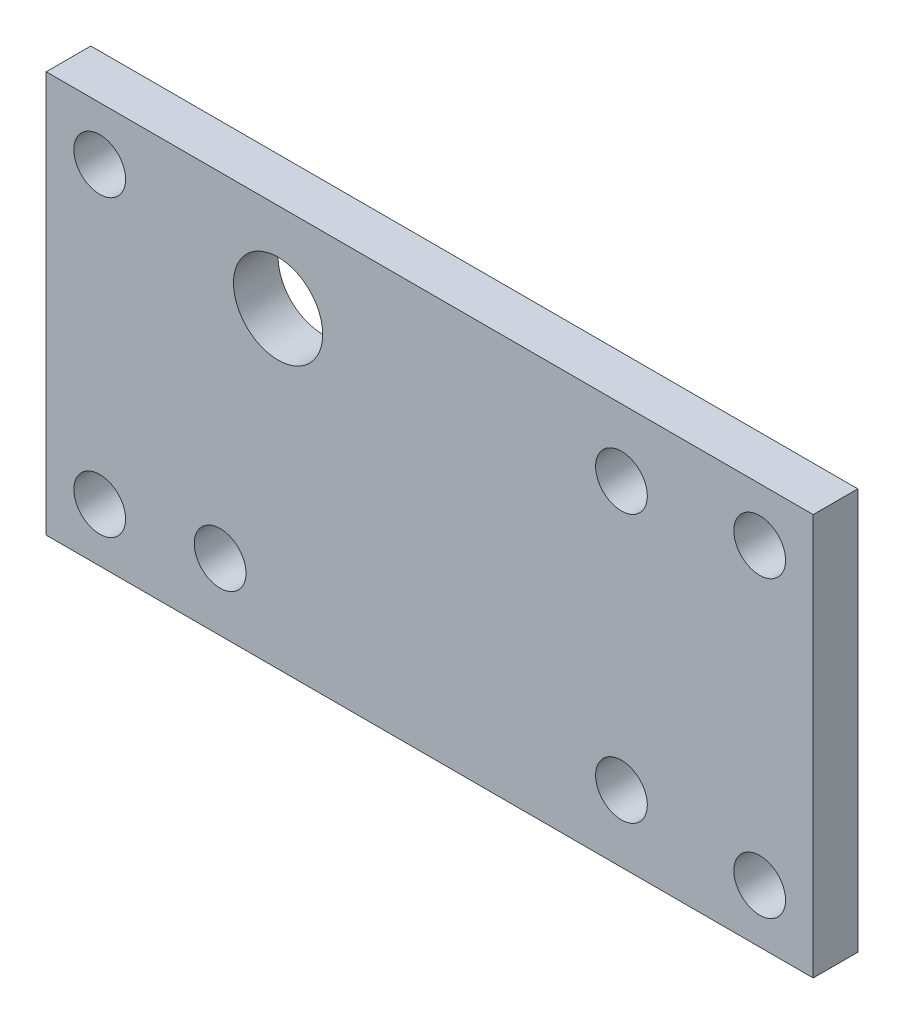
ISO-10303-21;
HEADER;
FILE_DESCRIPTION(('STEP AP214'),'2;1');
FILE_NAME('part.step','',(''),(''),'','','');
FILE_SCHEMA(('AUTOMOTIVE_DESIGN { 1 0 10303 214 1 1 1 1 }'));
ENDSEC;
DATA;
#1=APPLICATION_CONTEXT('core data for automotive mechanical design processes');
#2=APPLICATION_PROTOCOL_DEFINITION('international standard','automotive_design',2000,#1);
#3=PRODUCT_CONTEXT('',#1,'mechanical');
#4=PRODUCT('Part','Part','',(#3));
#5=PRODUCT_RELATED_PRODUCT_CATEGORY('part','',(#4));
#6=PRODUCT_DEFINITION_FORMATION('','',#4);
#7=PRODUCT_DEFINITION_CONTEXT('part definition',#1,'design');
#8=PRODUCT_DEFINITION('design','',#6,#7);
#9=PRODUCT_DEFINITION_SHAPE('','',#8);
#10=(LENGTH_UNIT() NAMED_UNIT(*) SI_UNIT(.MILLI.,.METRE.));
#11=(NAMED_UNIT(*) PLANE_ANGLE_UNIT() SI_UNIT($,.RADIAN.));
#12=(NAMED_UNIT(*) SI_UNIT($,.STERADIAN.) SOLID_ANGLE_UNIT());
#13=UNCERTAINTY_MEASURE_WITH_UNIT(LENGTH_MEASURE(1.E-05),#10,'distance_accuracy_value','');
#14=(GEOMETRIC_REPRESENTATION_CONTEXT(3) GLOBAL_UNCERTAINTY_ASSIGNED_CONTEXT((#13)) GLOBAL_UNIT_ASSIGNED_CONTEXT((#10,
#11,#12)) REPRESENTATION_CONTEXT('',''));
#15=CARTESIAN_POINT('',(0.,0.,0.));
#16=DIRECTION('',(0.,0.,1.));
#17=DIRECTION('',(1.,0.,0.));
#18=AXIS2_PLACEMENT_3D('',#15,#16,#17);
#19=CARTESIAN_POINT('',(0.,0.,3.175));
#20=DIRECTION('',(0.,0.,1.));
#21=DIRECTION('',(1.,0.,0.));
#22=AXIS2_PLACEMENT_3D('',#19,#20,#21);
#23=PLANE('',#22);
#24=CARTESIAN_POINT('',(-14.9225,-9.52500000000952,3.175));
#25=DIRECTION('',(0.,0.,1.));
#26=DIRECTION('',(1.,0.,0.));
#27=AXIS2_PLACEMENT_3D('',#24,#25,#26);
#28=CIRCLE('',#27,1.84149999999178);
#29=CARTESIAN_POINT('',(-13.0810000000082,-9.52500000000952,3.175));
#30=VERTEX_POINT('',#29);
#31=EDGE_CURVE('E189',#30,#30,#28,.T.);
#32=ORIENTED_EDGE('',*,*,#31,.F.);
#33=EDGE_LOOP('',(#32));
#34=FACE_BOUND('',#33,.T.);
#35=CARTESIAN_POINT('',(13.6525,-9.52500000000954,3.175));
#36=DIRECTION('',(0.,0.,1.));
#37=DIRECTION('',(1.,0.,0.));
#38=AXIS2_PLACEMENT_3D('',#35,#36,#37);
#39=CIRCLE('',#38,1.84149999999759);
#40=CARTESIAN_POINT('',(15.4939999999976,-9.52500000000954,3.175));
#41=VERTEX_POINT('',#40);
#42=EDGE_CURVE('E185',#41,#41,#39,.T.);
#43=ORIENTED_EDGE('',*,*,#42,.F.);
#44=EDGE_LOOP('',(#43));
#45=FACE_BOUND('',#44,.T.);
#46=CARTESIAN_POINT('',(13.6525,9.52499999999986,3.175));
#47=DIRECTION('',(0.,0.,1.));
#48=DIRECTION('',(1.,0.,0.));
#49=AXIS2_PLACEMENT_3D('',#46,#47,#48);
#50=CIRCLE('',#49,1.8415);
#51=CARTESIAN_POINT('',(15.494,9.52499999999986,3.175));
#52=VERTEX_POINT('',#51);
#53=EDGE_CURVE('E173',#52,#52,#50,.T.);
#54=ORIENTED_EDGE('',*,*,#53,.F.);
#55=EDGE_LOOP('',(#54));
#56=FACE_BOUND('',#55,.T.);
#57=CARTESIAN_POINT('',(23.495,10.4775,3.175));
#58=DIRECTION('',(0.,0.,1.));
#59=DIRECTION('',(1.,0.,0.));
#60=AXIS2_PLACEMENT_3D('',#57,#58,#59);
#61=CIRCLE('',#60,1.8415);
#62=CARTESIAN_POINT('',(25.3365,10.4775,3.175));
#63=VERTEX_POINT('',#62);
#64=EDGE_CURVE('E153',#63,#63,#61,.T.);
#65=ORIENTED_EDGE('',*,*,#64,.F.);
#66=EDGE_LOOP('',(#65));
#67=FACE_BOUND('',#66,.T.);
#68=CARTESIAN_POINT('',(23.495,-10.4775,3.175));
#69=DIRECTION('',(0.,0.,1.));
#70=DIRECTION('',(1.,0.,0.));
#71=AXIS2_PLACEMENT_3D('',#68,#69,#70);
#72=CIRCLE('',#71,1.8415);
#73=CARTESIAN_POINT('',(25.3365,-10.4775,3.175));
#74=VERTEX_POINT('',#73);
#75=EDGE_CURVE('E162',#74,#74,#72,.T.);
#76=ORIENTED_EDGE('',*,*,#75,.F.);
#77=EDGE_LOOP('',(#76));
#78=FACE_BOUND('',#77,.T.);
#79=CARTESIAN_POINT('',(-23.495,-10.4775,3.175));
#80=DIRECTION('',(0.,0.,1.));
#81=DIRECTION('',(1.,0.,0.));
#82=AXIS2_PLACEMENT_3D('',#79,#80,#81);
#83=CIRCLE('',#82,1.8415);
#84=CARTESIAN_POINT('',(-21.6535,-10.4775,3.175));
#85=VERTEX_POINT('',#84);
#86=EDGE_CURVE('E145',#85,#85,#83,.T.);
#87=ORIENTED_EDGE('',*,*,#86,.F.);
#88=EDGE_LOOP('',(#87));
#89=FACE_BOUND('',#88,.T.);
#90=CARTESIAN_POINT('',(-23.495,10.4775,3.175));
#91=DIRECTION('',(0.,0.,1.));
#92=DIRECTION('',(1.,0.,0.));
#93=AXIS2_PLACEMENT_3D('',#90,#91,#92);
#94=CIRCLE('',#93,1.8415);
#95=CARTESIAN_POINT('',(-21.6535,10.4775,3.175));
#96=VERTEX_POINT('',#95);
#97=EDGE_CURVE('E141',#96,#96,#94,.T.);
#98=ORIENTED_EDGE('',*,*,#97,.F.);
#99=EDGE_LOOP('',(#98));
#100=FACE_BOUND('',#99,.T.);
#101=DIRECTION('',(0.,1.,0.));
#102=VECTOR('',#101,1.);
#103=CARTESIAN_POINT('',(27.305,14.2875,3.175));
#104=LINE('',#103,#102);
#105=CARTESIAN_POINT('',(27.305,-14.2875,3.175));
#106=VERTEX_POINT('',#105);
#107=CARTESIAN_POINT('',(27.305,14.2875,3.175));
#108=VERTEX_POINT('',#107);
#109=EDGE_CURVE('E95',#106,#108,#104,.T.);
#110=ORIENTED_EDGE('',*,*,#109,.T.);
#111=DIRECTION('',(-1.,0.,0.));
#112=VECTOR('',#111,1.);
#113=CARTESIAN_POINT('',(-27.305,14.2875,3.175));
#114=LINE('',#113,#112);
#115=CARTESIAN_POINT('',(-27.305,14.2875,3.175));
#116=VERTEX_POINT('',#115);
#117=EDGE_CURVE('E90',#108,#116,#114,.T.);
#118=ORIENTED_EDGE('',*,*,#117,.T.);
#119=DIRECTION('',(0.,-1.,0.));
#120=VECTOR('',#119,1.);
#121=CARTESIAN_POINT('',(-27.305,14.2875,3.175));
#122=LINE('',#121,#120);
#123=CARTESIAN_POINT('',(-27.305,-14.2875,3.175));
#124=VERTEX_POINT('',#123);
#125=EDGE_CURVE('E93',#116,#124,#122,.T.);
#126=ORIENTED_EDGE('',*,*,#125,.T.);
#127=DIRECTION('',(1.,0.,0.));
#128=VECTOR('',#127,1.);
#129=CARTESIAN_POINT('',(-27.305,-14.2875,3.175));
#130=LINE('',#129,#128);
#131=EDGE_CURVE('E60',#124,#106,#130,.T.);
#132=ORIENTED_EDGE('',*,*,#131,.T.);
#133=EDGE_LOOP('',(#110,#118,#126,#132));
#134=FACE_BOUND('',#133,.T.);
#135=CARTESIAN_POINT('',(-10.795,7.9375,3.175));
#136=DIRECTION('',(0.,0.,1.));
#137=DIRECTION('',(1.,0.,0.));
#138=AXIS2_PLACEMENT_3D('',#135,#136,#137);
#139=CIRCLE('',#138,3.175);
#140=CARTESIAN_POINT('',(-7.62000000000001,7.9375,3.175));
#141=VERTEX_POINT('',#140);
#142=EDGE_CURVE('E115',#141,#141,#139,.T.);
#143=ORIENTED_EDGE('',*,*,#142,.F.);
#144=EDGE_LOOP('',(#143));
#145=FACE_BOUND('',#144,.T.);
#146=ADVANCED_FACE('F42',(#34,#45,#56,#67,#78,#89,#100,#134,#145),#23,.T.);
#147=CARTESIAN_POINT('',(0.,0.,0.));
#148=DIRECTION('',(0.,0.,1.));
#149=DIRECTION('',(1.,0.,0.));
#150=AXIS2_PLACEMENT_3D('',#147,#148,#149);
#151=PLANE('',#150);
#152=CARTESIAN_POINT('',(-14.9225,-9.52500000000952,0.));
#153=DIRECTION('',(0.,0.,1.));
#154=DIRECTION('',(1.,0.,0.));
#155=AXIS2_PLACEMENT_3D('',#152,#153,#154);
#156=CIRCLE('',#155,1.84149999999178);
#157=CARTESIAN_POINT('',(-13.0810000000082,-9.52500000000952,0.));
#158=VERTEX_POINT('',#157);
#159=EDGE_CURVE('E177',#158,#158,#156,.T.);
#160=ORIENTED_EDGE('',*,*,#159,.T.);
#161=EDGE_LOOP('',(#160));
#162=FACE_BOUND('',#161,.T.);
#163=CARTESIAN_POINT('',(13.6525,-9.52500000000954,0.));
#164=DIRECTION('',(0.,0.,1.));
#165=DIRECTION('',(1.,0.,0.));
#166=AXIS2_PLACEMENT_3D('',#163,#164,#165);
#167=CIRCLE('',#166,1.84149999999759);
#168=CARTESIAN_POINT('',(15.4939999999976,-9.52500000000954,0.));
#169=VERTEX_POINT('',#168);
#170=EDGE_CURVE('E181',#169,#169,#167,.T.);
#171=ORIENTED_EDGE('',*,*,#170,.T.);
#172=EDGE_LOOP('',(#171));
#173=FACE_BOUND('',#172,.T.);
#174=CARTESIAN_POINT('',(13.6525,9.52499999999986,0.));
#175=DIRECTION('',(0.,0.,1.));
#176=DIRECTION('',(1.,0.,0.));
#177=AXIS2_PLACEMENT_3D('',#174,#175,#176);
#178=CIRCLE('',#177,1.8415);
#179=CARTESIAN_POINT('',(15.494,9.52499999999986,0.));
#180=VERTEX_POINT('',#179);
#181=EDGE_CURVE('E154',#180,#180,#178,.T.);
#182=ORIENTED_EDGE('',*,*,#181,.T.);
#183=EDGE_LOOP('',(#182));
#184=FACE_BOUND('',#183,.T.);
#185=CARTESIAN_POINT('',(23.495,10.4775,0.));
#186=DIRECTION('',(0.,0.,1.));
#187=DIRECTION('',(1.,0.,0.));
#188=AXIS2_PLACEMENT_3D('',#185,#186,#187);
#189=CIRCLE('',#188,1.8415);
#190=CARTESIAN_POINT('',(25.3365,10.4775,0.));
#191=VERTEX_POINT('',#190);
#192=EDGE_CURVE('E149',#191,#191,#189,.T.);
#193=ORIENTED_EDGE('',*,*,#192,.T.);
#194=EDGE_LOOP('',(#193));
#195=FACE_BOUND('',#194,.T.);
#196=CARTESIAN_POINT('',(23.495,-10.4775,0.));
#197=DIRECTION('',(0.,0.,1.));
#198=DIRECTION('',(1.,0.,0.));
#199=AXIS2_PLACEMENT_3D('',#196,#197,#198);
#200=CIRCLE('',#199,1.8415);
#201=CARTESIAN_POINT('',(25.3365,-10.4775,0.));
#202=VERTEX_POINT('',#201);
#203=EDGE_CURVE('E158',#202,#202,#200,.T.);
#204=ORIENTED_EDGE('',*,*,#203,.T.);
#205=EDGE_LOOP('',(#204));
#206=FACE_BOUND('',#205,.T.);
#207=CARTESIAN_POINT('',(-23.495,-10.4775,0.));
#208=DIRECTION('',(0.,0.,1.));
#209=DIRECTION('',(1.,0.,0.));
#210=AXIS2_PLACEMENT_3D('',#207,#208,#209);
#211=CIRCLE('',#210,1.8415);
#212=CARTESIAN_POINT('',(-21.6535,-10.4775,0.));
#213=VERTEX_POINT('',#212);
#214=EDGE_CURVE('E166',#213,#213,#211,.T.);
#215=ORIENTED_EDGE('',*,*,#214,.T.);
#216=EDGE_LOOP('',(#215));
#217=FACE_BOUND('',#216,.T.);
#218=CARTESIAN_POINT('',(-23.495,10.4775,0.));
#219=DIRECTION('',(0.,0.,1.));
#220=DIRECTION('',(1.,0.,0.));
#221=AXIS2_PLACEMENT_3D('',#218,#219,#220);
#222=CIRCLE('',#221,1.8415);
#223=CARTESIAN_POINT('',(-21.6535,10.4775,0.));
#224=VERTEX_POINT('',#223);
#225=EDGE_CURVE('E137',#224,#224,#222,.T.);
#226=ORIENTED_EDGE('',*,*,#225,.T.);
#227=EDGE_LOOP('',(#226));
#228=FACE_BOUND('',#227,.T.);
#229=DIRECTION('',(0.,1.,0.));
#230=VECTOR('',#229,1.);
#231=CARTESIAN_POINT('',(27.305,14.2875,0.));
#232=LINE('',#231,#230);
#233=CARTESIAN_POINT('',(27.305,-14.2875,0.));
#234=VERTEX_POINT('',#233);
#235=CARTESIAN_POINT('',(27.305,14.2875,0.));
#236=VERTEX_POINT('',#235);
#237=EDGE_CURVE('E111',#234,#236,#232,.T.);
#238=ORIENTED_EDGE('',*,*,#237,.F.);
#239=DIRECTION('',(1.,0.,0.));
#240=VECTOR('',#239,1.);
#241=CARTESIAN_POINT('',(-27.305,-14.2875,0.));
#242=LINE('',#241,#240);
#243=CARTESIAN_POINT('',(-27.305,-14.2875,0.));
#244=VERTEX_POINT('',#243);
#245=EDGE_CURVE('E83',#244,#234,#242,.T.);
#246=ORIENTED_EDGE('',*,*,#245,.F.);
#247=DIRECTION('',(0.,-1.,0.));
#248=VECTOR('',#247,1.);
#249=CARTESIAN_POINT('',(-27.305,14.2875,0.));
#250=LINE('',#249,#248);
#251=CARTESIAN_POINT('',(-27.305,14.2875,0.));
#252=VERTEX_POINT('',#251);
#253=EDGE_CURVE('E77',#252,#244,#250,.T.);
#254=ORIENTED_EDGE('',*,*,#253,.F.);
#255=DIRECTION('',(-1.,0.,0.));
#256=VECTOR('',#255,1.);
#257=CARTESIAN_POINT('',(-27.305,14.2875,0.));
#258=LINE('',#257,#256);
#259=EDGE_CURVE('E100',#236,#252,#258,.T.);
#260=ORIENTED_EDGE('',*,*,#259,.F.);
#261=EDGE_LOOP('',(#238,#246,#254,#260));
#262=FACE_BOUND('',#261,.T.);
#263=CARTESIAN_POINT('',(-10.795,7.9375,0.));
#264=DIRECTION('',(0.,0.,1.));
#265=DIRECTION('',(1.,0.,0.));
#266=AXIS2_PLACEMENT_3D('',#263,#264,#265);
#267=CIRCLE('',#266,3.175);
#268=CARTESIAN_POINT('',(-7.62000000000001,7.9375,0.));
#269=VERTEX_POINT('',#268);
#270=EDGE_CURVE('E133',#269,#269,#267,.T.);
#271=ORIENTED_EDGE('',*,*,#270,.T.);
#272=EDGE_LOOP('',(#271));
#273=FACE_BOUND('',#272,.T.);
#274=ADVANCED_FACE('F128',(#162,#173,#184,#195,#206,#217,#228,#262,#273),#151,.F.);
#275=CARTESIAN_POINT('',(27.305,14.2875,3.175));
#276=DIRECTION('',(-1.,0.,0.));
#277=DIRECTION('',(0.,-1.,0.));
#278=AXIS2_PLACEMENT_3D('',#275,#276,#277);
#279=PLANE('',#278);
#280=ORIENTED_EDGE('',*,*,#237,.T.);
#281=DIRECTION('',(0.,0.,-1.));
#282=VECTOR('',#281,1.);
#283=CARTESIAN_POINT('',(27.305,14.2875,3.175));
#284=LINE('',#283,#282);
#285=EDGE_CURVE('E11',#108,#236,#284,.T.);
#286=ORIENTED_EDGE('',*,*,#285,.F.);
#287=ORIENTED_EDGE('',*,*,#109,.F.);
#288=DIRECTION('',(0.,0.,-1.));
#289=VECTOR('',#288,1.);
#290=CARTESIAN_POINT('',(27.305,-14.2875,3.175));
#291=LINE('',#290,#289);
#292=EDGE_CURVE('E107',#106,#234,#291,.T.);
#293=ORIENTED_EDGE('',*,*,#292,.T.);
#294=EDGE_LOOP('',(#280,#286,#287,#293));
#295=FACE_BOUND('',#294,.T.);
#296=ADVANCED_FACE('F44',(#295),#279,.F.);
#297=CARTESIAN_POINT('',(-27.305,14.2875,3.175));
#298=DIRECTION('',(0.,-1.,0.));
#299=DIRECTION('',(0.,0.,-1.));
#300=AXIS2_PLACEMENT_3D('',#297,#298,#299);
#301=PLANE('',#300);
#302=ORIENTED_EDGE('',*,*,#259,.T.);
#303=DIRECTION('',(0.,0.,-1.));
#304=VECTOR('',#303,1.);
#305=CARTESIAN_POINT('',(-27.305,14.2875,3.175));
#306=LINE('',#305,#304);
#307=EDGE_CURVE('E52',#116,#252,#306,.T.);
#308=ORIENTED_EDGE('',*,*,#307,.F.);
#309=ORIENTED_EDGE('',*,*,#117,.F.);
#310=ORIENTED_EDGE('',*,*,#285,.T.);
#311=EDGE_LOOP('',(#302,#308,#309,#310));
#312=FACE_BOUND('',#311,.T.);
#313=ADVANCED_FACE('F99',(#312),#301,.F.);
#314=CARTESIAN_POINT('',(-27.305,14.2875,3.175));
#315=DIRECTION('',(1.,0.,0.));
#316=DIRECTION('',(0.,1.,0.));
#317=AXIS2_PLACEMENT_3D('',#314,#315,#316);
#318=PLANE('',#317);
#319=ORIENTED_EDGE('',*,*,#253,.T.);
#320=DIRECTION('',(0.,0.,-1.));
#321=VECTOR('',#320,1.);
#322=CARTESIAN_POINT('',(-27.305,-14.2875,3.175));
#323=LINE('',#322,#321);
#324=EDGE_CURVE('E102',#124,#244,#323,.T.);
#325=ORIENTED_EDGE('',*,*,#324,.F.);
#326=ORIENTED_EDGE('',*,*,#125,.F.);
#327=ORIENTED_EDGE('',*,*,#307,.T.);
#328=EDGE_LOOP('',(#319,#325,#326,#327));
#329=FACE_BOUND('',#328,.T.);
#330=ADVANCED_FACE('F103',(#329),#318,.F.);
#331=CARTESIAN_POINT('',(-27.305,-14.2875,3.175));
#332=DIRECTION('',(0.,1.,0.));
#333=DIRECTION('',(0.,0.,1.));
#334=AXIS2_PLACEMENT_3D('',#331,#332,#333);
#335=PLANE('',#334);
#336=ORIENTED_EDGE('',*,*,#245,.T.);
#337=ORIENTED_EDGE('',*,*,#292,.F.);
#338=ORIENTED_EDGE('',*,*,#131,.F.);
#339=ORIENTED_EDGE('',*,*,#324,.T.);
#340=EDGE_LOOP('',(#336,#337,#338,#339));
#341=FACE_BOUND('',#340,.T.);
#342=ADVANCED_FACE('F125',(#341),#335,.F.);
#343=CARTESIAN_POINT('',(-10.795,7.9375,3.175));
#344=DIRECTION('',(0.,0.,-1.));
#345=DIRECTION('',(-1.,0.,0.));
#346=AXIS2_PLACEMENT_3D('',#343,#344,#345);
#347=CYLINDRICAL_SURFACE('',#346,3.175);
#348=ORIENTED_EDGE('',*,*,#142,.T.);
#349=EDGE_LOOP('',(#348));
#350=FACE_BOUND('',#349,.T.);
#351=ORIENTED_EDGE('',*,*,#270,.F.);
#352=EDGE_LOOP('',(#351));
#353=FACE_BOUND('',#352,.T.);
#354=ADVANCED_FACE('F224',(#350,#353),#347,.F.);
#355=CARTESIAN_POINT('',(-23.495,10.4775,0.));
#356=DIRECTION('',(0.,0.,1.));
#357=DIRECTION('',(1.,0.,0.));
#358=AXIS2_PLACEMENT_3D('',#355,#356,#357);
#359=CYLINDRICAL_SURFACE('',#358,1.8415);
#360=ORIENTED_EDGE('',*,*,#225,.F.);
#361=EDGE_LOOP('',(#360));
#362=FACE_BOUND('',#361,.T.);
#363=ORIENTED_EDGE('',*,*,#97,.T.);
#364=EDGE_LOOP('',(#363));
#365=FACE_BOUND('',#364,.T.);
#366=ADVANCED_FACE('F221',(#362,#365),#359,.F.);
#367=CARTESIAN_POINT('',(-23.495,-10.4775,0.));
#368=DIRECTION('',(0.,0.,1.));
#369=DIRECTION('',(1.,0.,0.));
#370=AXIS2_PLACEMENT_3D('',#367,#368,#369);
#371=CYLINDRICAL_SURFACE('',#370,1.8415);
#372=ORIENTED_EDGE('',*,*,#214,.F.);
#373=EDGE_LOOP('',(#372));
#374=FACE_BOUND('',#373,.T.);
#375=ORIENTED_EDGE('',*,*,#86,.T.);
#376=EDGE_LOOP('',(#375));
#377=FACE_BOUND('',#376,.T.);
#378=ADVANCED_FACE('F223',(#374,#377),#371,.F.);
#379=CARTESIAN_POINT('',(23.495,-10.4775,0.));
#380=DIRECTION('',(0.,0.,1.));
#381=DIRECTION('',(1.,0.,0.));
#382=AXIS2_PLACEMENT_3D('',#379,#380,#381);
#383=CYLINDRICAL_SURFACE('',#382,1.8415);
#384=ORIENTED_EDGE('',*,*,#203,.F.);
#385=EDGE_LOOP('',(#384));
#386=FACE_BOUND('',#385,.T.);
#387=ORIENTED_EDGE('',*,*,#75,.T.);
#388=EDGE_LOOP('',(#387));
#389=FACE_BOUND('',#388,.T.);
#390=ADVANCED_FACE('F231',(#386,#389),#383,.F.);
#391=CARTESIAN_POINT('',(23.495,10.4775,0.));
#392=DIRECTION('',(0.,0.,1.));
#393=DIRECTION('',(1.,0.,0.));
#394=AXIS2_PLACEMENT_3D('',#391,#392,#393);
#395=CYLINDRICAL_SURFACE('',#394,1.8415);
#396=ORIENTED_EDGE('',*,*,#192,.F.);
#397=EDGE_LOOP('',(#396));
#398=FACE_BOUND('',#397,.T.);
#399=ORIENTED_EDGE('',*,*,#64,.T.);
#400=EDGE_LOOP('',(#399));
#401=FACE_BOUND('',#400,.T.);
#402=ADVANCED_FACE('F238',(#398,#401),#395,.F.);
#403=CARTESIAN_POINT('',(13.6525,9.52499999999986,0.));
#404=DIRECTION('',(0.,0.,1.));
#405=DIRECTION('',(1.,0.,0.));
#406=AXIS2_PLACEMENT_3D('',#403,#404,#405);
#407=CYLINDRICAL_SURFACE('',#406,1.8415);
#408=ORIENTED_EDGE('',*,*,#181,.F.);
#409=EDGE_LOOP('',(#408));
#410=FACE_BOUND('',#409,.T.);
#411=ORIENTED_EDGE('',*,*,#53,.T.);
#412=EDGE_LOOP('',(#411));
#413=FACE_BOUND('',#412,.T.);
#414=ADVANCED_FACE('F270',(#410,#413),#407,.F.);
#415=CARTESIAN_POINT('',(13.6525,-9.52500000000954,0.));
#416=DIRECTION('',(0.,0.,1.));
#417=DIRECTION('',(1.,0.,0.));
#418=AXIS2_PLACEMENT_3D('',#415,#416,#417);
#419=CYLINDRICAL_SURFACE('',#418,1.84149999999759);
#420=ORIENTED_EDGE('',*,*,#170,.F.);
#421=EDGE_LOOP('',(#420));
#422=FACE_BOUND('',#421,.T.);
#423=ORIENTED_EDGE('',*,*,#42,.T.);
#424=EDGE_LOOP('',(#423));
#425=FACE_BOUND('',#424,.T.);
#426=ADVANCED_FACE('F202',(#422,#425),#419,.F.);
#427=CARTESIAN_POINT('',(-14.9225,-9.52500000000952,0.));
#428=DIRECTION('',(0.,0.,1.));
#429=DIRECTION('',(1.,0.,0.));
#430=AXIS2_PLACEMENT_3D('',#427,#428,#429);
#431=CYLINDRICAL_SURFACE('',#430,1.84149999999178);
#432=ORIENTED_EDGE('',*,*,#159,.F.);
#433=EDGE_LOOP('',(#432));
#434=FACE_BOUND('',#433,.T.);
#435=ORIENTED_EDGE('',*,*,#31,.T.);
#436=EDGE_LOOP('',(#435));
#437=FACE_BOUND('',#436,.T.);
#438=ADVANCED_FACE('F199',(#434,#437),#431,.F.);
#439=CLOSED_SHELL('',(#146,#274,#296,#313,#330,#342,#354,#366,#378,#390,#402,#414,#426,#438));
#440=MANIFOLD_SOLID_BREP('B2',#439);
#441=ADVANCED_BREP_SHAPE_REPRESENTATION('',(#18,#440),#14);
#442=SHAPE_DEFINITION_REPRESENTATION(#9,#441);
ENDSEC;
END-ISO-10303-21;
